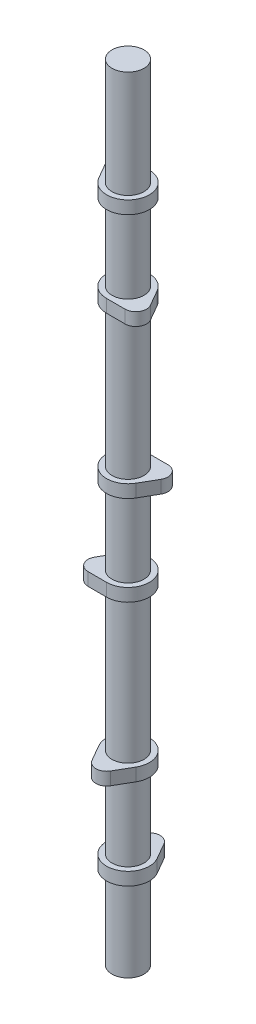
ISO-10303-21;
HEADER;
FILE_DESCRIPTION(('STEP AP214'),'2;1');
FILE_NAME('part.step','',(''),(''),'','','');
FILE_SCHEMA(('AUTOMOTIVE_DESIGN { 1 0 10303 214 1 1 1 1 }'));
ENDSEC;
DATA;
#1=APPLICATION_CONTEXT('core data for automotive mechanical design processes');
#2=APPLICATION_PROTOCOL_DEFINITION('international standard','automotive_design',2000,#1);
#3=PRODUCT_CONTEXT('',#1,'mechanical');
#4=PRODUCT('Part','Part','',(#3));
#5=PRODUCT_RELATED_PRODUCT_CATEGORY('part','',(#4));
#6=PRODUCT_DEFINITION_FORMATION('','',#4);
#7=PRODUCT_DEFINITION_CONTEXT('part definition',#1,'design');
#8=PRODUCT_DEFINITION('design','',#6,#7);
#9=PRODUCT_DEFINITION_SHAPE('','',#8);
#10=(LENGTH_UNIT() NAMED_UNIT(*) SI_UNIT(.MILLI.,.METRE.));
#11=(NAMED_UNIT(*) PLANE_ANGLE_UNIT() SI_UNIT($,.RADIAN.));
#12=(NAMED_UNIT(*) SI_UNIT($,.STERADIAN.) SOLID_ANGLE_UNIT());
#13=UNCERTAINTY_MEASURE_WITH_UNIT(LENGTH_MEASURE(1.E-05),#10,'distance_accuracy_value','');
#14=(GEOMETRIC_REPRESENTATION_CONTEXT(3) GLOBAL_UNCERTAINTY_ASSIGNED_CONTEXT((#13)) GLOBAL_UNIT_ASSIGNED_CONTEXT((#10,
#11,#12)) REPRESENTATION_CONTEXT('',''));
#15=CARTESIAN_POINT('',(0.,0.,0.));
#16=DIRECTION('',(0.,0.,1.));
#17=DIRECTION('',(1.,0.,0.));
#18=AXIS2_PLACEMENT_3D('',#15,#16,#17);
#19=CARTESIAN_POINT('',(0.,416.56,0.));
#20=DIRECTION('',(0.,-1.,0.));
#21=DIRECTION('',(0.,0.,-1.));
#22=AXIS2_PLACEMENT_3D('',#19,#20,#21);
#23=CYLINDRICAL_SURFACE('',#22,9.5);
#24=CARTESIAN_POINT('',(0.,299.73,0.));
#25=DIRECTION('',(0.,1.,0.));
#26=DIRECTION('',(0.,0.,1.));
#27=AXIS2_PLACEMENT_3D('',#24,#25,#26);
#28=CIRCLE('',#27,9.5);
#29=CARTESIAN_POINT('',(0.,299.73,9.5));
#30=VERTEX_POINT('',#29);
#31=EDGE_CURVE('E291',#30,#30,#28,.T.);
#32=ORIENTED_EDGE('',*,*,#31,.T.);
#33=EDGE_LOOP('',(#32));
#34=FACE_BOUND('',#33,.T.);
#35=CARTESIAN_POINT('',(0.,345.44,0.));
#36=DIRECTION('',(0.,1.,0.));
#37=DIRECTION('',(0.,0.,1.));
#38=AXIS2_PLACEMENT_3D('',#35,#36,#37);
#39=CIRCLE('',#38,9.5);
#40=CARTESIAN_POINT('',(0.,345.44,9.5));
#41=VERTEX_POINT('',#40);
#42=EDGE_CURVE('E11',#41,#41,#39,.T.);
#43=ORIENTED_EDGE('',*,*,#42,.F.);
#44=EDGE_LOOP('',(#43));
#45=FACE_BOUND('',#44,.T.);
#46=ADVANCED_FACE('F39',(#34,#45),#23,.T.);
#47=CARTESIAN_POINT('',(0.,207.02,0.));
#48=DIRECTION('',(0.,1.,0.));
#49=DIRECTION('',(0.,0.,1.));
#50=AXIS2_PLACEMENT_3D('',#47,#48,#49);
#51=CIRCLE('',#50,9.5);
#52=CARTESIAN_POINT('',(0.,207.02,9.5));
#53=VERTEX_POINT('',#52);
#54=EDGE_CURVE('E334',#53,#53,#51,.T.);
#55=ORIENTED_EDGE('',*,*,#54,.T.);
#56=EDGE_LOOP('',(#55));
#57=FACE_BOUND('',#56,.T.);
#58=CARTESIAN_POINT('',(0.,292.1,0.));
#59=DIRECTION('',(0.,1.,0.));
#60=DIRECTION('',(0.,0.,1.));
#61=AXIS2_PLACEMENT_3D('',#58,#59,#60);
#62=CIRCLE('',#61,9.5);
#63=CARTESIAN_POINT('',(0.,292.1,9.5));
#64=VERTEX_POINT('',#63);
#65=EDGE_CURVE('E50',#64,#64,#62,.T.);
#66=ORIENTED_EDGE('',*,*,#65,.F.);
#67=EDGE_LOOP('',(#66));
#68=FACE_BOUND('',#67,.T.);
#69=ADVANCED_FACE('F533',(#57,#68),#23,.T.);
#70=CARTESIAN_POINT('',(0.,153.68,0.));
#71=DIRECTION('',(0.,1.,0.));
#72=DIRECTION('',(0.,0.,1.));
#73=AXIS2_PLACEMENT_3D('',#70,#71,#72);
#74=CIRCLE('',#73,9.5);
#75=CARTESIAN_POINT('',(0.,153.68,9.5));
#76=VERTEX_POINT('',#75);
#77=EDGE_CURVE('E377',#76,#76,#74,.T.);
#78=ORIENTED_EDGE('',*,*,#77,.T.);
#79=EDGE_LOOP('',(#78));
#80=FACE_BOUND('',#79,.T.);
#81=CARTESIAN_POINT('',(0.,199.39,0.));
#82=DIRECTION('',(0.,1.,0.));
#83=DIRECTION('',(0.,0.,1.));
#84=AXIS2_PLACEMENT_3D('',#81,#82,#83);
#85=CIRCLE('',#84,9.5);
#86=CARTESIAN_POINT('',(0.,199.39,9.5));
#87=VERTEX_POINT('',#86);
#88=EDGE_CURVE('E481',#87,#87,#85,.T.);
#89=ORIENTED_EDGE('',*,*,#88,.F.);
#90=EDGE_LOOP('',(#89));
#91=FACE_BOUND('',#90,.T.);
#92=ADVANCED_FACE('F539',(#80,#91),#23,.T.);
#93=CARTESIAN_POINT('',(0.,60.97,0.));
#94=DIRECTION('',(0.,1.,0.));
#95=DIRECTION('',(0.,0.,1.));
#96=AXIS2_PLACEMENT_3D('',#93,#94,#95);
#97=CIRCLE('',#96,9.5);
#98=CARTESIAN_POINT('',(0.,60.97,9.5));
#99=VERTEX_POINT('',#98);
#100=EDGE_CURVE('E420',#99,#99,#97,.T.);
#101=ORIENTED_EDGE('',*,*,#100,.T.);
#102=EDGE_LOOP('',(#101));
#103=FACE_BOUND('',#102,.T.);
#104=CARTESIAN_POINT('',(0.,146.05,0.));
#105=DIRECTION('',(0.,1.,0.));
#106=DIRECTION('',(0.,0.,1.));
#107=AXIS2_PLACEMENT_3D('',#104,#105,#106);
#108=CIRCLE('',#107,9.5);
#109=CARTESIAN_POINT('',(0.,146.05,9.5));
#110=VERTEX_POINT('',#109);
#111=EDGE_CURVE('E474',#110,#110,#108,.T.);
#112=ORIENTED_EDGE('',*,*,#111,.F.);
#113=EDGE_LOOP('',(#112));
#114=FACE_BOUND('',#113,.T.);
#115=ADVANCED_FACE('F570',(#103,#114),#23,.T.);
#116=CARTESIAN_POINT('',(0.,7.63000000000003,0.));
#117=DIRECTION('',(0.,1.,0.));
#118=DIRECTION('',(0.,0.,1.));
#119=AXIS2_PLACEMENT_3D('',#116,#117,#118);
#120=CIRCLE('',#119,9.5);
#121=CARTESIAN_POINT('',(0.,7.63000000000003,9.5));
#122=VERTEX_POINT('',#121);
#123=EDGE_CURVE('E425',#122,#122,#120,.F.);
#124=ORIENTED_EDGE('',*,*,#123,.F.);
#125=EDGE_LOOP('',(#124));
#126=FACE_BOUND('',#125,.T.);
#127=CARTESIAN_POINT('',(0.,53.34,0.));
#128=DIRECTION('',(0.,1.,0.));
#129=DIRECTION('',(0.,0.,1.));
#130=AXIS2_PLACEMENT_3D('',#127,#128,#129);
#131=CIRCLE('',#130,9.5);
#132=CARTESIAN_POINT('',(0.,53.34,9.5));
#133=VERTEX_POINT('',#132);
#134=EDGE_CURVE('E470',#133,#133,#131,.T.);
#135=ORIENTED_EDGE('',*,*,#134,.F.);
#136=EDGE_LOOP('',(#135));
#137=FACE_BOUND('',#136,.T.);
#138=ADVANCED_FACE('F558',(#126,#137),#23,.T.);
#139=CARTESIAN_POINT('',(0.,7.63,-12.7));
#140=DIRECTION('',(0.,-1.,0.));
#141=DIRECTION('',(0.,0.,-1.));
#142=AXIS2_PLACEMENT_3D('',#139,#140,#141);
#143=CYLINDRICAL_SURFACE('',#142,6.35);
#144=CARTESIAN_POINT('',(0.,0.,-12.7));
#145=DIRECTION('',(0.,1.,0.));
#146=DIRECTION('',(0.,0.,1.));
#147=AXIS2_PLACEMENT_3D('',#144,#145,#146);
#148=CIRCLE('',#147,6.35);
#149=CARTESIAN_POINT('',(5.49926131403119,0.,-15.875));
#150=VERTEX_POINT('',#149);
#151=CARTESIAN_POINT('',(-5.49926131403118,0.,-15.875));
#152=VERTEX_POINT('',#151);
#153=EDGE_CURVE('E433',#150,#152,#148,.T.);
#154=ORIENTED_EDGE('',*,*,#153,.T.);
#155=DIRECTION('',(0.,-1.,0.));
#156=VECTOR('',#155,1.);
#157=CARTESIAN_POINT('',(-5.49926131403118,7.63,-15.875));
#158=LINE('',#157,#156);
#159=CARTESIAN_POINT('',(-5.49926131403118,7.63,-15.875));
#160=VERTEX_POINT('',#159);
#161=EDGE_CURVE('E463',#160,#152,#158,.T.);
#162=ORIENTED_EDGE('',*,*,#161,.F.);
#163=CARTESIAN_POINT('',(0.,7.63,-12.7));
#164=DIRECTION('',(0.,1.,0.));
#165=DIRECTION('',(0.,0.,1.));
#166=AXIS2_PLACEMENT_3D('',#163,#164,#165);
#167=CIRCLE('',#166,6.35);
#168=CARTESIAN_POINT('',(5.49926131403119,7.63,-15.875));
#169=VERTEX_POINT('',#168);
#170=EDGE_CURVE('E434',#169,#160,#167,.T.);
#171=ORIENTED_EDGE('',*,*,#170,.F.);
#172=DIRECTION('',(0.,-1.,0.));
#173=VECTOR('',#172,1.);
#174=CARTESIAN_POINT('',(5.49926131403119,7.63,-15.875));
#175=LINE('',#174,#173);
#176=EDGE_CURVE('E444',#169,#150,#175,.T.);
#177=ORIENTED_EDGE('',*,*,#176,.T.);
#178=EDGE_LOOP('',(#154,#162,#171,#177));
#179=FACE_BOUND('',#178,.T.);
#180=ADVANCED_FACE('F41',(#179),#143,.T.);
#181=CARTESIAN_POINT('',(-5.49926131403118,7.63,-15.875));
#182=DIRECTION('',(0.866025403784439,0.,0.5));
#183=DIRECTION('',(0.5,0.,-0.866025403784439));
#184=AXIS2_PLACEMENT_3D('',#181,#182,#183);
#185=PLANE('',#184);
#186=DIRECTION('',(-0.5,0.,0.866025403784439));
#187=VECTOR('',#186,1.);
#188=CARTESIAN_POINT('',(-5.49926131403118,0.,-15.875));
#189=LINE('',#188,#187);
#190=CARTESIAN_POINT('',(-10.9985226280624,0.,-6.35000000000001));
#191=VERTEX_POINT('',#190);
#192=EDGE_CURVE('E448',#152,#191,#189,.T.);
#193=ORIENTED_EDGE('',*,*,#192,.T.);
#194=DIRECTION('',(0.,-1.,0.));
#195=VECTOR('',#194,1.);
#196=CARTESIAN_POINT('',(-10.9985226280624,7.63,-6.35000000000001));
#197=LINE('',#196,#195);
#198=CARTESIAN_POINT('',(-10.9985226280624,7.63,-6.35000000000001));
#199=VERTEX_POINT('',#198);
#200=EDGE_CURVE('E460',#199,#191,#197,.T.);
#201=ORIENTED_EDGE('',*,*,#200,.F.);
#202=DIRECTION('',(-0.5,0.,0.866025403784439));
#203=VECTOR('',#202,1.);
#204=CARTESIAN_POINT('',(-5.49926131403118,7.63,-15.875));
#205=LINE('',#204,#203);
#206=EDGE_CURVE('E90',#160,#199,#205,.T.);
#207=ORIENTED_EDGE('',*,*,#206,.F.);
#208=ORIENTED_EDGE('',*,*,#161,.T.);
#209=EDGE_LOOP('',(#193,#201,#207,#208));
#210=FACE_BOUND('',#209,.T.);
#211=ADVANCED_FACE('F576',(#210),#185,.F.);
#212=CARTESIAN_POINT('',(0.,7.63,0.));
#213=DIRECTION('',(0.,-1.,0.));
#214=DIRECTION('',(0.,0.,-1.));
#215=AXIS2_PLACEMENT_3D('',#212,#213,#214);
#216=CYLINDRICAL_SURFACE('',#215,12.7);
#217=CARTESIAN_POINT('',(0.,0.,0.));
#218=DIRECTION('',(0.,1.,0.));
#219=DIRECTION('',(0.,0.,1.));
#220=AXIS2_PLACEMENT_3D('',#217,#218,#219);
#221=CIRCLE('',#220,12.7);
#222=CARTESIAN_POINT('',(10.9985226280624,0.,-6.35));
#223=VERTEX_POINT('',#222);
#224=EDGE_CURVE('E76',#191,#223,#221,.T.);
#225=ORIENTED_EDGE('',*,*,#224,.T.);
#226=DIRECTION('',(0.,-1.,0.));
#227=VECTOR('',#226,1.);
#228=CARTESIAN_POINT('',(10.9985226280624,7.63,-6.35));
#229=LINE('',#228,#227);
#230=CARTESIAN_POINT('',(10.9985226280624,7.63,-6.35));
#231=VERTEX_POINT('',#230);
#232=EDGE_CURVE('E457',#231,#223,#229,.T.);
#233=ORIENTED_EDGE('',*,*,#232,.F.);
#234=CARTESIAN_POINT('',(0.,7.63,0.));
#235=DIRECTION('',(0.,1.,0.));
#236=DIRECTION('',(0.,0.,1.));
#237=AXIS2_PLACEMENT_3D('',#234,#235,#236);
#238=CIRCLE('',#237,12.7);
#239=EDGE_CURVE('E439',#199,#231,#238,.T.);
#240=ORIENTED_EDGE('',*,*,#239,.F.);
#241=ORIENTED_EDGE('',*,*,#200,.T.);
#242=EDGE_LOOP('',(#225,#233,#240,#241));
#243=FACE_BOUND('',#242,.T.);
#244=ADVANCED_FACE('F908',(#243),#216,.T.);
#245=CARTESIAN_POINT('',(5.49926131403119,7.63,-15.875));
#246=DIRECTION('',(-0.866025403784439,0.,0.5));
#247=DIRECTION('',(0.5,0.,0.866025403784439));
#248=AXIS2_PLACEMENT_3D('',#245,#246,#247);
#249=PLANE('',#248);
#250=DIRECTION('',(-0.5,0.,-0.866025403784439));
#251=VECTOR('',#250,1.);
#252=CARTESIAN_POINT('',(5.49926131403119,0.,-15.875));
#253=LINE('',#252,#251);
#254=EDGE_CURVE('E82',#223,#150,#253,.T.);
#255=ORIENTED_EDGE('',*,*,#254,.T.);
#256=ORIENTED_EDGE('',*,*,#176,.F.);
#257=DIRECTION('',(-0.5,0.,-0.866025403784439));
#258=VECTOR('',#257,1.);
#259=CARTESIAN_POINT('',(5.49926131403119,7.63,-15.875));
#260=LINE('',#259,#258);
#261=EDGE_CURVE('E58',#231,#169,#260,.T.);
#262=ORIENTED_EDGE('',*,*,#261,.F.);
#263=ORIENTED_EDGE('',*,*,#232,.T.);
#264=EDGE_LOOP('',(#255,#256,#262,#263));
#265=FACE_BOUND('',#264,.T.);
#266=ADVANCED_FACE('F902',(#265),#249,.F.);
#267=CARTESIAN_POINT('',(0.,7.63,-12.7));
#268=DIRECTION('',(0.,1.,0.));
#269=DIRECTION('',(0.,0.,1.));
#270=AXIS2_PLACEMENT_3D('',#267,#268,#269);
#271=PLANE('',#270);
#272=ORIENTED_EDGE('',*,*,#123,.T.);
#273=EDGE_LOOP('',(#272));
#274=FACE_BOUND('',#273,.T.);
#275=ORIENTED_EDGE('',*,*,#170,.T.);
#276=ORIENTED_EDGE('',*,*,#206,.T.);
#277=ORIENTED_EDGE('',*,*,#239,.T.);
#278=ORIENTED_EDGE('',*,*,#261,.T.);
#279=EDGE_LOOP('',(#275,#276,#277,#278));
#280=FACE_BOUND('',#279,.T.);
#281=ADVANCED_FACE('F907',(#274,#280),#271,.T.);
#282=CARTESIAN_POINT('',(0.,0.,-12.7));
#283=DIRECTION('',(0.,1.,0.));
#284=DIRECTION('',(0.,0.,1.));
#285=AXIS2_PLACEMENT_3D('',#282,#283,#284);
#286=PLANE('',#285);
#287=CARTESIAN_POINT('',(0.,0.,0.));
#288=DIRECTION('',(0.,1.,0.));
#289=DIRECTION('',(0.,0.,1.));
#290=AXIS2_PLACEMENT_3D('',#287,#288,#289);
#291=CIRCLE('',#290,9.5);
#292=CARTESIAN_POINT('',(0.,0.,9.5));
#293=VERTEX_POINT('',#292);
#294=EDGE_CURVE('E466',#293,#293,#291,.F.);
#295=ORIENTED_EDGE('',*,*,#294,.F.);
#296=EDGE_LOOP('',(#295));
#297=FACE_BOUND('',#296,.T.);
#298=ORIENTED_EDGE('',*,*,#153,.F.);
#299=ORIENTED_EDGE('',*,*,#254,.F.);
#300=ORIENTED_EDGE('',*,*,#224,.F.);
#301=ORIENTED_EDGE('',*,*,#192,.F.);
#302=EDGE_LOOP('',(#298,#299,#300,#301));
#303=FACE_BOUND('',#302,.T.);
#304=ADVANCED_FACE('F566',(#297,#303),#286,.F.);
#305=CARTESIAN_POINT('',(0.,-49.53,0.));
#306=DIRECTION('',(0.,1.,0.));
#307=DIRECTION('',(0.,0.,1.));
#308=AXIS2_PLACEMENT_3D('',#305,#306,#307);
#309=PLANE('',#308);
#310=CARTESIAN_POINT('',(0.,-49.53,0.));
#311=DIRECTION('',(0.,1.,0.));
#312=DIRECTION('',(0.,0.,1.));
#313=AXIS2_PLACEMENT_3D('',#310,#311,#312);
#314=CIRCLE('',#313,9.5);
#315=CARTESIAN_POINT('',(0.,-49.53,9.5));
#316=VERTEX_POINT('',#315);
#317=EDGE_CURVE('E426',#316,#316,#314,.T.);
#318=ORIENTED_EDGE('',*,*,#317,.F.);
#319=EDGE_LOOP('',(#318));
#320=FACE_BOUND('',#319,.T.);
#321=ADVANCED_FACE('F556',(#320),#309,.F.);
#322=ORIENTED_EDGE('',*,*,#317,.T.);
#323=EDGE_LOOP('',(#322));
#324=FACE_BOUND('',#323,.T.);
#325=ORIENTED_EDGE('',*,*,#294,.T.);
#326=EDGE_LOOP('',(#325));
#327=FACE_BOUND('',#326,.T.);
#328=ADVANCED_FACE('F546',(#324,#327),#23,.T.);
#329=CARTESIAN_POINT('',(0.,60.97,12.7));
#330=DIRECTION('',(0.,-1.,0.));
#331=DIRECTION('',(0.,0.,1.));
#332=AXIS2_PLACEMENT_3D('',#329,#330,#331);
#333=CYLINDRICAL_SURFACE('',#332,6.35);
#334=CARTESIAN_POINT('',(0.,53.34,12.7));
#335=DIRECTION('',(0.,1.,0.));
#336=DIRECTION('',(0.,0.,-1.));
#337=AXIS2_PLACEMENT_3D('',#334,#335,#336);
#338=CIRCLE('',#337,6.35);
#339=CARTESIAN_POINT('',(-5.4992613140313,53.34,15.875));
#340=VERTEX_POINT('',#339);
#341=CARTESIAN_POINT('',(5.49926131403107,53.34,15.875));
#342=VERTEX_POINT('',#341);
#343=EDGE_CURVE('E393',#340,#342,#338,.T.);
#344=ORIENTED_EDGE('',*,*,#343,.T.);
#345=DIRECTION('',(0.,-1.,0.));
#346=VECTOR('',#345,1.);
#347=CARTESIAN_POINT('',(5.49926131403107,60.97,15.875));
#348=LINE('',#347,#346);
#349=CARTESIAN_POINT('',(5.49926131403107,60.97,15.875));
#350=VERTEX_POINT('',#349);
#351=EDGE_CURVE('E416',#350,#342,#348,.T.);
#352=ORIENTED_EDGE('',*,*,#351,.F.);
#353=CARTESIAN_POINT('',(0.,60.97,12.7));
#354=DIRECTION('',(0.,1.,0.));
#355=DIRECTION('',(0.,0.,-1.));
#356=AXIS2_PLACEMENT_3D('',#353,#354,#355);
#357=CIRCLE('',#356,6.35);
#358=CARTESIAN_POINT('',(-5.4992613140313,60.97,15.875));
#359=VERTEX_POINT('',#358);
#360=EDGE_CURVE('E378',#359,#350,#357,.T.);
#361=ORIENTED_EDGE('',*,*,#360,.F.);
#362=DIRECTION('',(0.,-1.,0.));
#363=VECTOR('',#362,1.);
#364=CARTESIAN_POINT('',(-5.4992613140313,60.97,15.875));
#365=LINE('',#364,#363);
#366=EDGE_CURVE('E392',#359,#340,#365,.T.);
#367=ORIENTED_EDGE('',*,*,#366,.T.);
#368=EDGE_LOOP('',(#344,#352,#361,#367));
#369=FACE_BOUND('',#368,.T.);
#370=ADVANCED_FACE('F555',(#369),#333,.T.);
#371=CARTESIAN_POINT('',(5.49926131403107,60.97,15.875));
#372=DIRECTION('',(-0.866025403784435,0.,-0.500000000000006));
#373=DIRECTION('',(-0.500000000000006,0.,0.866025403784435));
#374=AXIS2_PLACEMENT_3D('',#371,#372,#373);
#375=PLANE('',#374);
#376=DIRECTION('',(0.500000000000006,0.,-0.866025403784435));
#377=VECTOR('',#376,1.);
#378=CARTESIAN_POINT('',(5.49926131403107,53.34,15.875));
#379=LINE('',#378,#377);
#380=CARTESIAN_POINT('',(10.9985226280623,53.34,6.35000000000008));
#381=VERTEX_POINT('',#380);
#382=EDGE_CURVE('E397',#342,#381,#379,.T.);
#383=ORIENTED_EDGE('',*,*,#382,.T.);
#384=DIRECTION('',(0.,-1.,0.));
#385=VECTOR('',#384,1.);
#386=CARTESIAN_POINT('',(10.9985226280623,60.97,6.35000000000008));
#387=LINE('',#386,#385);
#388=CARTESIAN_POINT('',(10.9985226280623,60.97,6.35000000000008));
#389=VERTEX_POINT('',#388);
#390=EDGE_CURVE('E412',#389,#381,#387,.T.);
#391=ORIENTED_EDGE('',*,*,#390,.F.);
#392=DIRECTION('',(0.500000000000006,0.,-0.866025403784435));
#393=VECTOR('',#392,1.);
#394=CARTESIAN_POINT('',(5.49926131403107,60.97,15.875));
#395=LINE('',#394,#393);
#396=EDGE_CURVE('E382',#350,#389,#395,.T.);
#397=ORIENTED_EDGE('',*,*,#396,.F.);
#398=ORIENTED_EDGE('',*,*,#351,.T.);
#399=EDGE_LOOP('',(#383,#391,#397,#398));
#400=FACE_BOUND('',#399,.T.);
#401=ADVANCED_FACE('F563',(#400),#375,.F.);
#402=CARTESIAN_POINT('',(0.,60.97,0.));
#403=DIRECTION('',(0.,-1.,0.));
#404=DIRECTION('',(0.,0.,1.));
#405=AXIS2_PLACEMENT_3D('',#402,#403,#404);
#406=CYLINDRICAL_SURFACE('',#405,12.7);
#407=CARTESIAN_POINT('',(0.,53.34,0.));
#408=DIRECTION('',(0.,1.,0.));
#409=DIRECTION('',(0.,0.,-1.));
#410=AXIS2_PLACEMENT_3D('',#407,#408,#409);
#411=CIRCLE('',#410,12.7);
#412=CARTESIAN_POINT('',(-10.9985226280624,53.34,6.34999999999992));
#413=VERTEX_POINT('',#412);
#414=EDGE_CURVE('E400',#381,#413,#411,.T.);
#415=ORIENTED_EDGE('',*,*,#414,.T.);
#416=DIRECTION('',(0.,-1.,0.));
#417=VECTOR('',#416,1.);
#418=CARTESIAN_POINT('',(-10.9985226280624,60.97,6.34999999999992));
#419=LINE('',#418,#417);
#420=CARTESIAN_POINT('',(-10.9985226280624,60.97,6.34999999999992));
#421=VERTEX_POINT('',#420);
#422=EDGE_CURVE('E408',#421,#413,#419,.T.);
#423=ORIENTED_EDGE('',*,*,#422,.F.);
#424=CARTESIAN_POINT('',(0.,60.97,0.));
#425=DIRECTION('',(0.,1.,0.));
#426=DIRECTION('',(0.,0.,-1.));
#427=AXIS2_PLACEMENT_3D('',#424,#425,#426);
#428=CIRCLE('',#427,12.7);
#429=EDGE_CURVE('E386',#389,#421,#428,.T.);
#430=ORIENTED_EDGE('',*,*,#429,.F.);
#431=ORIENTED_EDGE('',*,*,#390,.T.);
#432=EDGE_LOOP('',(#415,#423,#430,#431));
#433=FACE_BOUND('',#432,.T.);
#434=ADVANCED_FACE('F601',(#433),#406,.T.);
#435=CARTESIAN_POINT('',(-5.4992613140313,60.97,15.875));
#436=DIRECTION('',(0.866025403784442,0.,-0.499999999999994));
#437=DIRECTION('',(-0.499999999999994,0.,-0.866025403784442));
#438=AXIS2_PLACEMENT_3D('',#435,#436,#437);
#439=PLANE('',#438);
#440=DIRECTION('',(0.499999999999994,0.,0.866025403784442));
#441=VECTOR('',#440,1.);
#442=CARTESIAN_POINT('',(-5.4992613140313,53.34,15.875));
#443=LINE('',#442,#441);
#444=EDGE_CURVE('E383',#413,#340,#443,.T.);
#445=ORIENTED_EDGE('',*,*,#444,.T.);
#446=ORIENTED_EDGE('',*,*,#366,.F.);
#447=DIRECTION('',(0.499999999999994,0.,0.866025403784442));
#448=VECTOR('',#447,1.);
#449=CARTESIAN_POINT('',(-5.4992613140313,60.97,15.875));
#450=LINE('',#449,#448);
#451=EDGE_CURVE('E389',#421,#359,#450,.T.);
#452=ORIENTED_EDGE('',*,*,#451,.F.);
#453=ORIENTED_EDGE('',*,*,#422,.T.);
#454=EDGE_LOOP('',(#445,#446,#452,#453));
#455=FACE_BOUND('',#454,.T.);
#456=ADVANCED_FACE('F597',(#455),#439,.F.);
#457=CARTESIAN_POINT('',(0.,60.97,12.7));
#458=DIRECTION('',(0.,1.,0.));
#459=DIRECTION('',(0.,0.,-1.));
#460=AXIS2_PLACEMENT_3D('',#457,#458,#459);
#461=PLANE('',#460);
#462=ORIENTED_EDGE('',*,*,#100,.F.);
#463=EDGE_LOOP('',(#462));
#464=FACE_BOUND('',#463,.T.);
#465=ORIENTED_EDGE('',*,*,#360,.T.);
#466=ORIENTED_EDGE('',*,*,#396,.T.);
#467=ORIENTED_EDGE('',*,*,#429,.T.);
#468=ORIENTED_EDGE('',*,*,#451,.T.);
#469=EDGE_LOOP('',(#465,#466,#467,#468));
#470=FACE_BOUND('',#469,.T.);
#471=ADVANCED_FACE('F587',(#464,#470),#461,.T.);
#472=CARTESIAN_POINT('',(0.,53.34,12.7));
#473=DIRECTION('',(0.,1.,0.));
#474=DIRECTION('',(0.,0.,-1.));
#475=AXIS2_PLACEMENT_3D('',#472,#473,#474);
#476=PLANE('',#475);
#477=ORIENTED_EDGE('',*,*,#134,.T.);
#478=EDGE_LOOP('',(#477));
#479=FACE_BOUND('',#478,.T.);
#480=ORIENTED_EDGE('',*,*,#343,.F.);
#481=ORIENTED_EDGE('',*,*,#444,.F.);
#482=ORIENTED_EDGE('',*,*,#414,.F.);
#483=ORIENTED_EDGE('',*,*,#382,.F.);
#484=EDGE_LOOP('',(#480,#481,#482,#483));
#485=FACE_BOUND('',#484,.T.);
#486=ADVANCED_FACE('F583',(#479,#485),#476,.F.);
#487=CARTESIAN_POINT('',(-10.9985226280623,153.68,6.35000000000005));
#488=DIRECTION('',(0.,-1.,0.));
#489=DIRECTION('',(-0.866025403784436,0.,0.500000000000004));
#490=AXIS2_PLACEMENT_3D('',#487,#488,#489);
#491=CYLINDRICAL_SURFACE('',#490,6.35);
#492=CARTESIAN_POINT('',(-10.9985226280623,146.05,6.35000000000005));
#493=DIRECTION('',(0.,1.,0.));
#494=DIRECTION('',(0.866025403784436,0.,-0.500000000000004));
#495=AXIS2_PLACEMENT_3D('',#492,#493,#494);
#496=CIRCLE('',#495,6.35);
#497=CARTESIAN_POINT('',(-16.4977839420935,146.05,3.17500000000008));
#498=VERTEX_POINT('',#497);
#499=CARTESIAN_POINT('',(-10.9985226280623,146.05,12.7000000000001));
#500=VERTEX_POINT('',#499);
#501=EDGE_CURVE('E350',#498,#500,#496,.T.);
#502=ORIENTED_EDGE('',*,*,#501,.T.);
#503=DIRECTION('',(0.,-1.,0.));
#504=VECTOR('',#503,1.);
#505=CARTESIAN_POINT('',(-10.9985226280623,153.68,12.7000000000001));
#506=LINE('',#505,#504);
#507=CARTESIAN_POINT('',(-10.9985226280623,153.68,12.7000000000001));
#508=VERTEX_POINT('',#507);
#509=EDGE_CURVE('E373',#508,#500,#506,.T.);
#510=ORIENTED_EDGE('',*,*,#509,.F.);
#511=CARTESIAN_POINT('',(-10.9985226280623,153.68,6.35000000000005));
#512=DIRECTION('',(0.,1.,0.));
#513=DIRECTION('',(0.866025403784436,0.,-0.500000000000004));
#514=AXIS2_PLACEMENT_3D('',#511,#512,#513);
#515=CIRCLE('',#514,6.35);
#516=CARTESIAN_POINT('',(-16.4977839420935,153.68,3.17500000000008));
#517=VERTEX_POINT('',#516);
#518=EDGE_CURVE('E335',#517,#508,#515,.T.);
#519=ORIENTED_EDGE('',*,*,#518,.F.);
#520=DIRECTION('',(0.,-1.,0.));
#521=VECTOR('',#520,1.);
#522=CARTESIAN_POINT('',(-16.4977839420935,153.68,3.17500000000008));
#523=LINE('',#522,#521);
#524=EDGE_CURVE('E349',#517,#498,#523,.T.);
#525=ORIENTED_EDGE('',*,*,#524,.T.);
#526=EDGE_LOOP('',(#502,#510,#519,#525));
#527=FACE_BOUND('',#526,.T.);
#528=ADVANCED_FACE('F586',(#527),#491,.T.);
#529=CARTESIAN_POINT('',(-10.9985226280623,153.68,12.7000000000001));
#530=DIRECTION('',(0.,0.,-1.));
#531=DIRECTION('',(-1.,0.,0.));
#532=AXIS2_PLACEMENT_3D('',#529,#530,#531);
#533=PLANE('',#532);
#534=DIRECTION('',(1.,0.,0.));
#535=VECTOR('',#534,1.);
#536=CARTESIAN_POINT('',(-10.9985226280623,146.05,12.7000000000001));
#537=LINE('',#536,#535);
#538=CARTESIAN_POINT('',(0.,146.05,12.7));
#539=VERTEX_POINT('',#538);
#540=EDGE_CURVE('E354',#500,#539,#537,.T.);
#541=ORIENTED_EDGE('',*,*,#540,.T.);
#542=DIRECTION('',(0.,-1.,0.));
#543=VECTOR('',#542,1.);
#544=CARTESIAN_POINT('',(0.,153.68,12.7));
#545=LINE('',#544,#543);
#546=CARTESIAN_POINT('',(0.,153.68,12.7));
#547=VERTEX_POINT('',#546);
#548=EDGE_CURVE('E369',#547,#539,#545,.T.);
#549=ORIENTED_EDGE('',*,*,#548,.F.);
#550=DIRECTION('',(1.,0.,0.));
#551=VECTOR('',#550,1.);
#552=CARTESIAN_POINT('',(-10.9985226280623,153.68,12.7000000000001));
#553=LINE('',#552,#551);
#554=EDGE_CURVE('E339',#508,#547,#553,.T.);
#555=ORIENTED_EDGE('',*,*,#554,.F.);
#556=ORIENTED_EDGE('',*,*,#509,.T.);
#557=EDGE_LOOP('',(#541,#549,#555,#556));
#558=FACE_BOUND('',#557,.T.);
#559=ADVANCED_FACE('F650',(#558),#533,.F.);
#560=CARTESIAN_POINT('',(0.,153.68,0.));
#561=DIRECTION('',(0.,-1.,0.));
#562=DIRECTION('',(-0.866025403784436,0.,0.500000000000004));
#563=AXIS2_PLACEMENT_3D('',#560,#561,#562);
#564=CYLINDRICAL_SURFACE('',#563,12.7);
#565=CARTESIAN_POINT('',(0.,146.05,0.));
#566=DIRECTION('',(0.,1.,0.));
#567=DIRECTION('',(0.866025403784436,0.,-0.500000000000004));
#568=AXIS2_PLACEMENT_3D('',#565,#566,#567);
#569=CIRCLE('',#568,12.7);
#570=CARTESIAN_POINT('',(-10.9985226280624,146.05,-6.34999999999995));
#571=VERTEX_POINT('',#570);
#572=EDGE_CURVE('E357',#539,#571,#569,.T.);
#573=ORIENTED_EDGE('',*,*,#572,.T.);
#574=DIRECTION('',(0.,-1.,0.));
#575=VECTOR('',#574,1.);
#576=CARTESIAN_POINT('',(-10.9985226280624,153.68,-6.34999999999995));
#577=LINE('',#576,#575);
#578=CARTESIAN_POINT('',(-10.9985226280624,153.68,-6.34999999999995));
#579=VERTEX_POINT('',#578);
#580=EDGE_CURVE('E365',#579,#571,#577,.T.);
#581=ORIENTED_EDGE('',*,*,#580,.F.);
#582=CARTESIAN_POINT('',(0.,153.68,0.));
#583=DIRECTION('',(0.,1.,0.));
#584=DIRECTION('',(0.866025403784436,0.,-0.500000000000004));
#585=AXIS2_PLACEMENT_3D('',#582,#583,#584);
#586=CIRCLE('',#585,12.7);
#587=EDGE_CURVE('E343',#547,#579,#586,.T.);
#588=ORIENTED_EDGE('',*,*,#587,.F.);
#589=ORIENTED_EDGE('',*,*,#548,.T.);
#590=EDGE_LOOP('',(#573,#581,#588,#589));
#591=FACE_BOUND('',#590,.T.);
#592=ADVANCED_FACE('F659',(#591),#564,.T.);
#593=CARTESIAN_POINT('',(-16.4977839420935,153.68,3.17500000000008));
#594=DIRECTION('',(0.866025403784441,0.,0.499999999999996));
#595=DIRECTION('',(0.499999999999996,0.,-0.866025403784441));
#596=AXIS2_PLACEMENT_3D('',#593,#594,#595);
#597=PLANE('',#596);
#598=DIRECTION('',(-0.499999999999996,0.,0.866025403784441));
#599=VECTOR('',#598,1.);
#600=CARTESIAN_POINT('',(-16.4977839420935,146.05,3.17500000000008));
#601=LINE('',#600,#599);
#602=EDGE_CURVE('E340',#571,#498,#601,.T.);
#603=ORIENTED_EDGE('',*,*,#602,.T.);
#604=ORIENTED_EDGE('',*,*,#524,.F.);
#605=DIRECTION('',(-0.499999999999996,0.,0.866025403784441));
#606=VECTOR('',#605,1.);
#607=CARTESIAN_POINT('',(-16.4977839420935,153.68,3.17500000000008));
#608=LINE('',#607,#606);
#609=EDGE_CURVE('E346',#579,#517,#608,.T.);
#610=ORIENTED_EDGE('',*,*,#609,.F.);
#611=ORIENTED_EDGE('',*,*,#580,.T.);
#612=EDGE_LOOP('',(#603,#604,#610,#611));
#613=FACE_BOUND('',#612,.T.);
#614=ADVANCED_FACE('F668',(#613),#597,.F.);
#615=CARTESIAN_POINT('',(-10.9985226280623,153.68,6.35000000000005));
#616=DIRECTION('',(0.,1.,0.));
#617=DIRECTION('',(0.866025403784436,0.,-0.500000000000004));
#618=AXIS2_PLACEMENT_3D('',#615,#616,#617);
#619=PLANE('',#618);
#620=ORIENTED_EDGE('',*,*,#77,.F.);
#621=EDGE_LOOP('',(#620));
#622=FACE_BOUND('',#621,.T.);
#623=ORIENTED_EDGE('',*,*,#518,.T.);
#624=ORIENTED_EDGE('',*,*,#554,.T.);
#625=ORIENTED_EDGE('',*,*,#587,.T.);
#626=ORIENTED_EDGE('',*,*,#609,.T.);
#627=EDGE_LOOP('',(#623,#624,#625,#626));
#628=FACE_BOUND('',#627,.T.);
#629=ADVANCED_FACE('F678',(#622,#628),#619,.T.);
#630=CARTESIAN_POINT('',(-10.9985226280623,146.05,6.35000000000005));
#631=DIRECTION('',(0.,1.,0.));
#632=DIRECTION('',(0.866025403784436,0.,-0.500000000000004));
#633=AXIS2_PLACEMENT_3D('',#630,#631,#632);
#634=PLANE('',#633);
#635=ORIENTED_EDGE('',*,*,#111,.T.);
#636=EDGE_LOOP('',(#635));
#637=FACE_BOUND('',#636,.T.);
#638=ORIENTED_EDGE('',*,*,#501,.F.);
#639=ORIENTED_EDGE('',*,*,#602,.F.);
#640=ORIENTED_EDGE('',*,*,#572,.F.);
#641=ORIENTED_EDGE('',*,*,#540,.F.);
#642=EDGE_LOOP('',(#638,#639,#640,#641));
#643=FACE_BOUND('',#642,.T.);
#644=ADVANCED_FACE('F688',(#637,#643),#634,.F.);
#645=CARTESIAN_POINT('',(10.9985226280624,207.02,-6.34999999999997));
#646=DIRECTION('',(0.,-1.,0.));
#647=DIRECTION('',(0.86602540378444,0.,-0.499999999999998));
#648=AXIS2_PLACEMENT_3D('',#645,#646,#647);
#649=CYLINDRICAL_SURFACE('',#648,6.35);
#650=CARTESIAN_POINT('',(10.9985226280624,199.39,-6.34999999999997));
#651=DIRECTION('',(0.,1.,0.));
#652=DIRECTION('',(-0.86602540378444,0.,0.499999999999998));
#653=AXIS2_PLACEMENT_3D('',#650,#651,#652);
#654=CIRCLE('',#653,6.35);
#655=CARTESIAN_POINT('',(16.4977839420936,199.39,-3.17499999999996));
#656=VERTEX_POINT('',#655);
#657=CARTESIAN_POINT('',(10.9985226280624,199.39,-12.7));
#658=VERTEX_POINT('',#657);
#659=EDGE_CURVE('E307',#656,#658,#654,.T.);
#660=ORIENTED_EDGE('',*,*,#659,.T.);
#661=DIRECTION('',(0.,-1.,0.));
#662=VECTOR('',#661,1.);
#663=CARTESIAN_POINT('',(10.9985226280624,207.02,-12.7));
#664=LINE('',#663,#662);
#665=CARTESIAN_POINT('',(10.9985226280624,207.02,-12.7));
#666=VERTEX_POINT('',#665);
#667=EDGE_CURVE('E330',#666,#658,#664,.T.);
#668=ORIENTED_EDGE('',*,*,#667,.F.);
#669=CARTESIAN_POINT('',(10.9985226280624,207.02,-6.34999999999997));
#670=DIRECTION('',(0.,1.,0.));
#671=DIRECTION('',(-0.86602540378444,0.,0.499999999999998));
#672=AXIS2_PLACEMENT_3D('',#669,#670,#671);
#673=CIRCLE('',#672,6.35);
#674=CARTESIAN_POINT('',(16.4977839420936,207.02,-3.17499999999996));
#675=VERTEX_POINT('',#674);
#676=EDGE_CURVE('E292',#675,#666,#673,.T.);
#677=ORIENTED_EDGE('',*,*,#676,.F.);
#678=DIRECTION('',(0.,-1.,0.));
#679=VECTOR('',#678,1.);
#680=CARTESIAN_POINT('',(16.4977839420936,207.02,-3.17499999999996));
#681=LINE('',#680,#679);
#682=EDGE_CURVE('E306',#675,#656,#681,.T.);
#683=ORIENTED_EDGE('',*,*,#682,.T.);
#684=EDGE_LOOP('',(#660,#668,#677,#683));
#685=FACE_BOUND('',#684,.T.);
#686=ADVANCED_FACE('F698',(#685),#649,.T.);
#687=CARTESIAN_POINT('',(10.9985226280624,207.02,-12.7));
#688=DIRECTION('',(0.,0.,1.));
#689=DIRECTION('',(1.,0.,0.));
#690=AXIS2_PLACEMENT_3D('',#687,#688,#689);
#691=PLANE('',#690);
#692=DIRECTION('',(-1.,0.,0.));
#693=VECTOR('',#692,1.);
#694=CARTESIAN_POINT('',(10.9985226280624,199.39,-12.7));
#695=LINE('',#694,#693);
#696=CARTESIAN_POINT('',(0.,199.39,-12.7));
#697=VERTEX_POINT('',#696);
#698=EDGE_CURVE('E311',#658,#697,#695,.T.);
#699=ORIENTED_EDGE('',*,*,#698,.T.);
#700=DIRECTION('',(0.,-1.,0.));
#701=VECTOR('',#700,1.);
#702=CARTESIAN_POINT('',(0.,207.02,-12.7));
#703=LINE('',#702,#701);
#704=CARTESIAN_POINT('',(0.,207.02,-12.7));
#705=VERTEX_POINT('',#704);
#706=EDGE_CURVE('E326',#705,#697,#703,.T.);
#707=ORIENTED_EDGE('',*,*,#706,.F.);
#708=DIRECTION('',(-1.,0.,0.));
#709=VECTOR('',#708,1.);
#710=CARTESIAN_POINT('',(10.9985226280624,207.02,-12.7));
#711=LINE('',#710,#709);
#712=EDGE_CURVE('E296',#666,#705,#711,.T.);
#713=ORIENTED_EDGE('',*,*,#712,.F.);
#714=ORIENTED_EDGE('',*,*,#667,.T.);
#715=EDGE_LOOP('',(#699,#707,#713,#714));
#716=FACE_BOUND('',#715,.T.);
#717=ADVANCED_FACE('F708',(#716),#691,.F.);
#718=CARTESIAN_POINT('',(0.,207.02,0.));
#719=DIRECTION('',(0.,-1.,0.));
#720=DIRECTION('',(0.86602540378444,0.,-0.499999999999998));
#721=AXIS2_PLACEMENT_3D('',#718,#719,#720);
#722=CYLINDRICAL_SURFACE('',#721,12.7);
#723=CARTESIAN_POINT('',(0.,199.39,0.));
#724=DIRECTION('',(0.,1.,0.));
#725=DIRECTION('',(-0.86602540378444,0.,0.499999999999998));
#726=AXIS2_PLACEMENT_3D('',#723,#724,#725);
#727=CIRCLE('',#726,12.7);
#728=CARTESIAN_POINT('',(10.9985226280624,199.39,6.35000000000003));
#729=VERTEX_POINT('',#728);
#730=EDGE_CURVE('E314',#697,#729,#727,.T.);
#731=ORIENTED_EDGE('',*,*,#730,.T.);
#732=DIRECTION('',(0.,-1.,0.));
#733=VECTOR('',#732,1.);
#734=CARTESIAN_POINT('',(10.9985226280624,207.02,6.35000000000003));
#735=LINE('',#734,#733);
#736=CARTESIAN_POINT('',(10.9985226280624,207.02,6.35000000000003));
#737=VERTEX_POINT('',#736);
#738=EDGE_CURVE('E322',#737,#729,#735,.T.);
#739=ORIENTED_EDGE('',*,*,#738,.F.);
#740=CARTESIAN_POINT('',(0.,207.02,0.));
#741=DIRECTION('',(0.,1.,0.));
#742=DIRECTION('',(-0.86602540378444,0.,0.499999999999998));
#743=AXIS2_PLACEMENT_3D('',#740,#741,#742);
#744=CIRCLE('',#743,12.7);
#745=EDGE_CURVE('E300',#705,#737,#744,.T.);
#746=ORIENTED_EDGE('',*,*,#745,.F.);
#747=ORIENTED_EDGE('',*,*,#706,.T.);
#748=EDGE_LOOP('',(#731,#739,#746,#747));
#749=FACE_BOUND('',#748,.T.);
#750=ADVANCED_FACE('F718',(#749),#722,.T.);
#751=CARTESIAN_POINT('',(16.4977839420936,207.02,-3.17499999999996));
#752=DIRECTION('',(-0.866025403784437,0.,-0.500000000000002));
#753=DIRECTION('',(-0.500000000000002,0.,0.866025403784437));
#754=AXIS2_PLACEMENT_3D('',#751,#752,#753);
#755=PLANE('',#754);
#756=DIRECTION('',(0.500000000000002,0.,-0.866025403784437));
#757=VECTOR('',#756,1.);
#758=CARTESIAN_POINT('',(16.4977839420936,199.39,-3.17499999999996));
#759=LINE('',#758,#757);
#760=EDGE_CURVE('E297',#729,#656,#759,.T.);
#761=ORIENTED_EDGE('',*,*,#760,.T.);
#762=ORIENTED_EDGE('',*,*,#682,.F.);
#763=DIRECTION('',(0.500000000000002,0.,-0.866025403784437));
#764=VECTOR('',#763,1.);
#765=CARTESIAN_POINT('',(16.4977839420936,207.02,-3.17499999999996));
#766=LINE('',#765,#764);
#767=EDGE_CURVE('E303',#737,#675,#766,.T.);
#768=ORIENTED_EDGE('',*,*,#767,.F.);
#769=ORIENTED_EDGE('',*,*,#738,.T.);
#770=EDGE_LOOP('',(#761,#762,#768,#769));
#771=FACE_BOUND('',#770,.T.);
#772=ADVANCED_FACE('F728',(#771),#755,.F.);
#773=CARTESIAN_POINT('',(10.9985226280624,207.02,-6.34999999999997));
#774=DIRECTION('',(0.,1.,0.));
#775=DIRECTION('',(-0.86602540378444,0.,0.499999999999998));
#776=AXIS2_PLACEMENT_3D('',#773,#774,#775);
#777=PLANE('',#776);
#778=ORIENTED_EDGE('',*,*,#54,.F.);
#779=EDGE_LOOP('',(#778));
#780=FACE_BOUND('',#779,.T.);
#781=ORIENTED_EDGE('',*,*,#676,.T.);
#782=ORIENTED_EDGE('',*,*,#712,.T.);
#783=ORIENTED_EDGE('',*,*,#745,.T.);
#784=ORIENTED_EDGE('',*,*,#767,.T.);
#785=EDGE_LOOP('',(#781,#782,#783,#784));
#786=FACE_BOUND('',#785,.T.);
#787=ADVANCED_FACE('F738',(#780,#786),#777,.T.);
#788=CARTESIAN_POINT('',(10.9985226280624,199.39,-6.34999999999997));
#789=DIRECTION('',(0.,1.,0.));
#790=DIRECTION('',(-0.86602540378444,0.,0.499999999999998));
#791=AXIS2_PLACEMENT_3D('',#788,#789,#790);
#792=PLANE('',#791);
#793=ORIENTED_EDGE('',*,*,#88,.T.);
#794=EDGE_LOOP('',(#793));
#795=FACE_BOUND('',#794,.T.);
#796=ORIENTED_EDGE('',*,*,#659,.F.);
#797=ORIENTED_EDGE('',*,*,#760,.F.);
#798=ORIENTED_EDGE('',*,*,#730,.F.);
#799=ORIENTED_EDGE('',*,*,#698,.F.);
#800=EDGE_LOOP('',(#796,#797,#798,#799));
#801=FACE_BOUND('',#800,.T.);
#802=ADVANCED_FACE('F748',(#795,#801),#792,.F.);
#803=CARTESIAN_POINT('',(10.9985226280624,299.73,6.3499999999999));
#804=DIRECTION('',(0.,-1.,0.));
#805=DIRECTION('',(0.866025403784443,0.,0.499999999999992));
#806=AXIS2_PLACEMENT_3D('',#803,#804,#805);
#807=CYLINDRICAL_SURFACE('',#806,6.35);
#808=CARTESIAN_POINT('',(10.9985226280624,292.1,6.3499999999999));
#809=DIRECTION('',(0.,1.,0.));
#810=DIRECTION('',(-0.866025403784443,0.,-0.499999999999992));
#811=AXIS2_PLACEMENT_3D('',#808,#809,#810);
#812=CIRCLE('',#811,6.35);
#813=CARTESIAN_POINT('',(10.9985226280625,292.1,12.6999999999999));
#814=VERTEX_POINT('',#813);
#815=CARTESIAN_POINT('',(16.4977839420936,292.1,3.17499999999985));
#816=VERTEX_POINT('',#815);
#817=EDGE_CURVE('E245',#814,#816,#812,.T.);
#818=ORIENTED_EDGE('',*,*,#817,.T.);
#819=DIRECTION('',(0.,-1.,0.));
#820=VECTOR('',#819,1.);
#821=CARTESIAN_POINT('',(16.4977839420936,299.73,3.17499999999985));
#822=LINE('',#821,#820);
#823=CARTESIAN_POINT('',(16.4977839420936,299.73,3.17499999999985));
#824=VERTEX_POINT('',#823);
#825=EDGE_CURVE('E287',#824,#816,#822,.T.);
#826=ORIENTED_EDGE('',*,*,#825,.F.);
#827=CARTESIAN_POINT('',(10.9985226280624,299.73,6.3499999999999));
#828=DIRECTION('',(0.,1.,0.));
#829=DIRECTION('',(-0.866025403784443,0.,-0.499999999999992));
#830=AXIS2_PLACEMENT_3D('',#827,#828,#829);
#831=CIRCLE('',#830,6.35);
#832=CARTESIAN_POINT('',(10.9985226280625,299.73,12.6999999999999));
#833=VERTEX_POINT('',#832);
#834=EDGE_CURVE('E250',#833,#824,#831,.T.);
#835=ORIENTED_EDGE('',*,*,#834,.F.);
#836=DIRECTION('',(0.,-1.,0.));
#837=VECTOR('',#836,1.);
#838=CARTESIAN_POINT('',(10.9985226280625,299.73,12.6999999999999));
#839=LINE('',#838,#837);
#840=EDGE_CURVE('E264',#833,#814,#839,.T.);
#841=ORIENTED_EDGE('',*,*,#840,.T.);
#842=EDGE_LOOP('',(#818,#826,#835,#841));
#843=FACE_BOUND('',#842,.T.);
#844=ADVANCED_FACE('F512',(#843),#807,.T.);
#845=CARTESIAN_POINT('',(16.4977839420936,299.73,3.17499999999985));
#846=DIRECTION('',(-0.866025403784434,0.,0.500000000000008));
#847=DIRECTION('',(0.500000000000008,0.,0.866025403784434));
#848=AXIS2_PLACEMENT_3D('',#845,#846,#847);
#849=PLANE('',#848);
#850=DIRECTION('',(-0.500000000000008,0.,-0.866025403784434));
#851=VECTOR('',#850,1.);
#852=CARTESIAN_POINT('',(16.4977839420936,292.1,3.17499999999985));
#853=LINE('',#852,#851);
#854=CARTESIAN_POINT('',(10.9985226280623,292.1,-6.3500000000001));
#855=VERTEX_POINT('',#854);
#856=EDGE_CURVE('E268',#816,#855,#853,.T.);
#857=ORIENTED_EDGE('',*,*,#856,.T.);
#858=DIRECTION('',(0.,-1.,0.));
#859=VECTOR('',#858,1.);
#860=CARTESIAN_POINT('',(10.9985226280623,299.73,-6.3500000000001));
#861=LINE('',#860,#859);
#862=CARTESIAN_POINT('',(10.9985226280623,299.73,-6.3500000000001));
#863=VERTEX_POINT('',#862);
#864=EDGE_CURVE('E283',#863,#855,#861,.T.);
#865=ORIENTED_EDGE('',*,*,#864,.F.);
#866=DIRECTION('',(-0.500000000000008,0.,-0.866025403784434));
#867=VECTOR('',#866,1.);
#868=CARTESIAN_POINT('',(16.4977839420936,299.73,3.17499999999985));
#869=LINE('',#868,#867);
#870=EDGE_CURVE('E254',#824,#863,#869,.T.);
#871=ORIENTED_EDGE('',*,*,#870,.F.);
#872=ORIENTED_EDGE('',*,*,#825,.T.);
#873=EDGE_LOOP('',(#857,#865,#871,#872));
#874=FACE_BOUND('',#873,.T.);
#875=ADVANCED_FACE('F515',(#874),#849,.F.);
#876=CARTESIAN_POINT('',(0.,299.73,0.));
#877=DIRECTION('',(0.,-1.,0.));
#878=DIRECTION('',(0.866025403784443,0.,0.499999999999992));
#879=AXIS2_PLACEMENT_3D('',#876,#877,#878);
#880=CYLINDRICAL_SURFACE('',#879,12.7);
#881=CARTESIAN_POINT('',(0.,292.1,0.));
#882=DIRECTION('',(0.,1.,0.));
#883=DIRECTION('',(-0.866025403784443,0.,-0.499999999999992));
#884=AXIS2_PLACEMENT_3D('',#881,#882,#883);
#885=CIRCLE('',#884,12.7);
#886=CARTESIAN_POINT('',(1.17093834628434E-13,292.1,12.7));
#887=VERTEX_POINT('',#886);
#888=EDGE_CURVE('E271',#855,#887,#885,.T.);
#889=ORIENTED_EDGE('',*,*,#888,.T.);
#890=DIRECTION('',(0.,-1.,0.));
#891=VECTOR('',#890,1.);
#892=CARTESIAN_POINT('',(1.17093834628434E-13,299.73,12.7));
#893=LINE('',#892,#891);
#894=CARTESIAN_POINT('',(1.17093834628434E-13,299.73,12.7));
#895=VERTEX_POINT('',#894);
#896=EDGE_CURVE('E279',#895,#887,#893,.T.);
#897=ORIENTED_EDGE('',*,*,#896,.F.);
#898=CARTESIAN_POINT('',(0.,299.73,0.));
#899=DIRECTION('',(0.,1.,0.));
#900=DIRECTION('',(-0.866025403784443,0.,-0.499999999999992));
#901=AXIS2_PLACEMENT_3D('',#898,#899,#900);
#902=CIRCLE('',#901,12.7);
#903=EDGE_CURVE('E258',#863,#895,#902,.T.);
#904=ORIENTED_EDGE('',*,*,#903,.F.);
#905=ORIENTED_EDGE('',*,*,#864,.T.);
#906=EDGE_LOOP('',(#889,#897,#904,#905));
#907=FACE_BOUND('',#906,.T.);
#908=ADVANCED_FACE('F520',(#907),#880,.T.);
#909=CARTESIAN_POINT('',(10.9985226280625,299.73,12.6999999999999));
#910=DIRECTION('',(0.,0.,-1.));
#911=DIRECTION('',(-1.,0.,0.));
#912=AXIS2_PLACEMENT_3D('',#909,#910,#911);
#913=PLANE('',#912);
#914=DIRECTION('',(1.,0.,0.));
#915=VECTOR('',#914,1.);
#916=CARTESIAN_POINT('',(10.9985226280625,292.1,12.6999999999999));
#917=LINE('',#916,#915);
#918=EDGE_CURVE('E255',#887,#814,#917,.T.);
#919=ORIENTED_EDGE('',*,*,#918,.T.);
#920=ORIENTED_EDGE('',*,*,#840,.F.);
#921=DIRECTION('',(1.,0.,0.));
#922=VECTOR('',#921,1.);
#923=CARTESIAN_POINT('',(10.9985226280625,299.73,12.6999999999999));
#924=LINE('',#923,#922);
#925=EDGE_CURVE('E261',#895,#833,#924,.T.);
#926=ORIENTED_EDGE('',*,*,#925,.F.);
#927=ORIENTED_EDGE('',*,*,#896,.T.);
#928=EDGE_LOOP('',(#919,#920,#926,#927));
#929=FACE_BOUND('',#928,.T.);
#930=ADVANCED_FACE('F504',(#929),#913,.F.);
#931=CARTESIAN_POINT('',(10.9985226280624,299.73,6.3499999999999));
#932=DIRECTION('',(0.,1.,0.));
#933=DIRECTION('',(-0.866025403784443,0.,-0.499999999999992));
#934=AXIS2_PLACEMENT_3D('',#931,#932,#933);
#935=PLANE('',#934);
#936=ORIENTED_EDGE('',*,*,#31,.F.);
#937=EDGE_LOOP('',(#936));
#938=FACE_BOUND('',#937,.T.);
#939=ORIENTED_EDGE('',*,*,#834,.T.);
#940=ORIENTED_EDGE('',*,*,#870,.T.);
#941=ORIENTED_EDGE('',*,*,#903,.T.);
#942=ORIENTED_EDGE('',*,*,#925,.T.);
#943=EDGE_LOOP('',(#939,#940,#941,#942));
#944=FACE_BOUND('',#943,.T.);
#945=ADVANCED_FACE('F500',(#938,#944),#935,.T.);
#946=CARTESIAN_POINT('',(10.9985226280624,292.1,6.3499999999999));
#947=DIRECTION('',(0.,1.,0.));
#948=DIRECTION('',(-0.866025403784443,0.,-0.499999999999992));
#949=AXIS2_PLACEMENT_3D('',#946,#947,#948);
#950=PLANE('',#949);
#951=ORIENTED_EDGE('',*,*,#65,.T.);
#952=EDGE_LOOP('',(#951));
#953=FACE_BOUND('',#952,.T.);
#954=ORIENTED_EDGE('',*,*,#817,.F.);
#955=ORIENTED_EDGE('',*,*,#918,.F.);
#956=ORIENTED_EDGE('',*,*,#888,.F.);
#957=ORIENTED_EDGE('',*,*,#856,.F.);
#958=EDGE_LOOP('',(#954,#955,#956,#957));
#959=FACE_BOUND('',#958,.T.);
#960=ADVANCED_FACE('F503',(#953,#959),#950,.F.);
#961=CARTESIAN_POINT('',(-10.9985226280624,353.07,-6.34999999999997));
#962=DIRECTION('',(0.,-1.,0.));
#963=DIRECTION('',(-0.86602540378444,0.,-0.499999999999998));
#964=AXIS2_PLACEMENT_3D('',#961,#962,#963);
#965=CYLINDRICAL_SURFACE('',#964,6.35);
#966=CARTESIAN_POINT('',(-10.9985226280624,345.44,-6.34999999999997));
#967=DIRECTION('',(0.,1.,0.));
#968=DIRECTION('',(0.86602540378444,0.,0.499999999999998));
#969=AXIS2_PLACEMENT_3D('',#966,#967,#968);
#970=CIRCLE('',#969,6.35);
#971=CARTESIAN_POINT('',(-10.9985226280624,345.44,-12.7));
#972=VERTEX_POINT('',#971);
#973=CARTESIAN_POINT('',(-16.4977839420936,345.44,-3.17499999999996));
#974=VERTEX_POINT('',#973);
#975=EDGE_CURVE('E239',#972,#974,#970,.T.);
#976=ORIENTED_EDGE('',*,*,#975,.T.);
#977=DIRECTION('',(0.,-1.,0.));
#978=VECTOR('',#977,1.);
#979=CARTESIAN_POINT('',(-16.4977839420936,353.07,-3.17499999999996));
#980=LINE('',#979,#978);
#981=CARTESIAN_POINT('',(-16.4977839420936,353.07,-3.17499999999996));
#982=VERTEX_POINT('',#981);
#983=EDGE_CURVE('E217',#982,#974,#980,.T.);
#984=ORIENTED_EDGE('',*,*,#983,.F.);
#985=CARTESIAN_POINT('',(-10.9985226280624,353.07,-6.34999999999997));
#986=DIRECTION('',(0.,1.,0.));
#987=DIRECTION('',(0.86602540378444,0.,0.499999999999998));
#988=AXIS2_PLACEMENT_3D('',#985,#986,#987);
#989=CIRCLE('',#988,6.35);
#990=CARTESIAN_POINT('',(-10.9985226280624,353.07,-12.7));
#991=VERTEX_POINT('',#990);
#992=EDGE_CURVE('E225',#991,#982,#989,.T.);
#993=ORIENTED_EDGE('',*,*,#992,.F.);
#994=DIRECTION('',(0.,-1.,0.));
#995=VECTOR('',#994,1.);
#996=CARTESIAN_POINT('',(-10.9985226280624,353.07,-12.7));
#997=LINE('',#996,#995);
#998=EDGE_CURVE('E1010',#991,#972,#997,.T.);
#999=ORIENTED_EDGE('',*,*,#998,.T.);
#1000=EDGE_LOOP('',(#976,#984,#993,#999));
#1001=FACE_BOUND('',#1000,.T.);
#1002=ADVANCED_FACE('F237',(#1001),#965,.T.);
#1003=CARTESIAN_POINT('',(-16.4977839420936,353.07,-3.17499999999996));
#1004=DIRECTION('',(0.866025403784437,0.,-0.500000000000002));
#1005=DIRECTION('',(-0.500000000000002,0.,-0.866025403784437));
#1006=AXIS2_PLACEMENT_3D('',#1003,#1004,#1005);
#1007=PLANE('',#1006);
#1008=DIRECTION('',(0.500000000000002,0.,0.866025403784437));
#1009=VECTOR('',#1008,1.);
#1010=CARTESIAN_POINT('',(-16.4977839420936,345.44,-3.17499999999996));
#1011=LINE('',#1010,#1009);
#1012=CARTESIAN_POINT('',(-10.9985226280624,345.44,6.35000000000002));
#1013=VERTEX_POINT('',#1012);
#1014=EDGE_CURVE('E997',#974,#1013,#1011,.T.);
#1015=ORIENTED_EDGE('',*,*,#1014,.T.);
#1016=DIRECTION('',(0.,-1.,0.));
#1017=VECTOR('',#1016,1.);
#1018=CARTESIAN_POINT('',(-10.9985226280624,353.07,6.35000000000002));
#1019=LINE('',#1018,#1017);
#1020=CARTESIAN_POINT('',(-10.9985226280624,353.07,6.35000000000002));
#1021=VERTEX_POINT('',#1020);
#1022=EDGE_CURVE('E220',#1021,#1013,#1019,.T.);
#1023=ORIENTED_EDGE('',*,*,#1022,.F.);
#1024=DIRECTION('',(0.500000000000002,0.,0.866025403784437));
#1025=VECTOR('',#1024,1.);
#1026=CARTESIAN_POINT('',(-16.4977839420936,353.07,-3.17499999999996));
#1027=LINE('',#1026,#1025);
#1028=EDGE_CURVE('E213',#982,#1021,#1027,.T.);
#1029=ORIENTED_EDGE('',*,*,#1028,.F.);
#1030=ORIENTED_EDGE('',*,*,#983,.T.);
#1031=EDGE_LOOP('',(#1015,#1023,#1029,#1030));
#1032=FACE_BOUND('',#1031,.T.);
#1033=ADVANCED_FACE('F215',(#1032),#1007,.F.);
#1034=CARTESIAN_POINT('',(0.,353.07,0.));
#1035=DIRECTION('',(0.,-1.,0.));
#1036=DIRECTION('',(-0.86602540378444,0.,-0.499999999999998));
#1037=AXIS2_PLACEMENT_3D('',#1034,#1035,#1036);
#1038=CYLINDRICAL_SURFACE('',#1037,12.7);
#1039=CARTESIAN_POINT('',(0.,345.44,0.));
#1040=DIRECTION('',(0.,1.,0.));
#1041=DIRECTION('',(0.86602540378444,0.,0.499999999999998));
#1042=AXIS2_PLACEMENT_3D('',#1039,#1040,#1041);
#1043=CIRCLE('',#1042,12.7);
#1044=CARTESIAN_POINT('',(0.,345.44,-12.7));
#1045=VERTEX_POINT('',#1044);
#1046=EDGE_CURVE('E1001',#1013,#1045,#1043,.T.);
#1047=ORIENTED_EDGE('',*,*,#1046,.T.);
#1048=DIRECTION('',(0.,-1.,0.));
#1049=VECTOR('',#1048,1.);
#1050=CARTESIAN_POINT('',(0.,353.07,-12.7));
#1051=LINE('',#1050,#1049);
#1052=CARTESIAN_POINT('',(0.,353.07,-12.7));
#1053=VERTEX_POINT('',#1052);
#1054=EDGE_CURVE('E246',#1053,#1045,#1051,.T.);
#1055=ORIENTED_EDGE('',*,*,#1054,.F.);
#1056=CARTESIAN_POINT('',(0.,353.07,0.));
#1057=DIRECTION('',(0.,1.,0.));
#1058=DIRECTION('',(0.86602540378444,0.,0.499999999999998));
#1059=AXIS2_PLACEMENT_3D('',#1056,#1057,#1058);
#1060=CIRCLE('',#1059,12.7);
#1061=EDGE_CURVE('E224',#1021,#1053,#1060,.T.);
#1062=ORIENTED_EDGE('',*,*,#1061,.F.);
#1063=ORIENTED_EDGE('',*,*,#1022,.T.);
#1064=EDGE_LOOP('',(#1047,#1055,#1062,#1063));
#1065=FACE_BOUND('',#1064,.T.);
#1066=ADVANCED_FACE('F814',(#1065),#1038,.T.);
#1067=CARTESIAN_POINT('',(-10.9985226280624,353.07,-12.7));
#1068=DIRECTION('',(0.,0.,1.));
#1069=DIRECTION('',(1.,0.,0.));
#1070=AXIS2_PLACEMENT_3D('',#1067,#1068,#1069);
#1071=PLANE('',#1070);
#1072=DIRECTION('',(-1.,0.,0.));
#1073=VECTOR('',#1072,1.);
#1074=CARTESIAN_POINT('',(-10.9985226280624,345.44,-12.7));
#1075=LINE('',#1074,#1073);
#1076=EDGE_CURVE('E235',#1045,#972,#1075,.T.);
#1077=ORIENTED_EDGE('',*,*,#1076,.T.);
#1078=ORIENTED_EDGE('',*,*,#998,.F.);
#1079=DIRECTION('',(-1.,0.,0.));
#1080=VECTOR('',#1079,1.);
#1081=CARTESIAN_POINT('',(-10.9985226280624,353.07,-12.7));
#1082=LINE('',#1081,#1080);
#1083=EDGE_CURVE('E230',#1053,#991,#1082,.T.);
#1084=ORIENTED_EDGE('',*,*,#1083,.F.);
#1085=ORIENTED_EDGE('',*,*,#1054,.T.);
#1086=EDGE_LOOP('',(#1077,#1078,#1084,#1085));
#1087=FACE_BOUND('',#1086,.T.);
#1088=ADVANCED_FACE('F823',(#1087),#1071,.F.);
#1089=CARTESIAN_POINT('',(-10.9985226280624,353.07,-6.34999999999997));
#1090=DIRECTION('',(0.,1.,0.));
#1091=DIRECTION('',(0.86602540378444,0.,0.499999999999998));
#1092=AXIS2_PLACEMENT_3D('',#1089,#1090,#1091);
#1093=PLANE('',#1092);
#1094=CARTESIAN_POINT('',(0.,353.07,0.));
#1095=DIRECTION('',(0.,1.,0.));
#1096=DIRECTION('',(0.,0.,1.));
#1097=AXIS2_PLACEMENT_3D('',#1094,#1095,#1096);
#1098=CIRCLE('',#1097,9.5);
#1099=CARTESIAN_POINT('',(0.,353.07,9.5));
#1100=VERTEX_POINT('',#1099);
#1101=EDGE_CURVE('E43',#1100,#1100,#1098,.T.);
#1102=ORIENTED_EDGE('',*,*,#1101,.F.);
#1103=EDGE_LOOP('',(#1102));
#1104=FACE_BOUND('',#1103,.T.);
#1105=ORIENTED_EDGE('',*,*,#992,.T.);
#1106=ORIENTED_EDGE('',*,*,#1028,.T.);
#1107=ORIENTED_EDGE('',*,*,#1061,.T.);
#1108=ORIENTED_EDGE('',*,*,#1083,.T.);
#1109=EDGE_LOOP('',(#1105,#1106,#1107,#1108));
#1110=FACE_BOUND('',#1109,.T.);
#1111=ADVANCED_FACE('F228',(#1104,#1110),#1093,.T.);
#1112=CARTESIAN_POINT('',(-10.9985226280624,345.44,-6.34999999999997));
#1113=DIRECTION('',(0.,1.,0.));
#1114=DIRECTION('',(0.86602540378444,0.,0.499999999999998));
#1115=AXIS2_PLACEMENT_3D('',#1112,#1113,#1114);
#1116=PLANE('',#1115);
#1117=ORIENTED_EDGE('',*,*,#42,.T.);
#1118=EDGE_LOOP('',(#1117));
#1119=FACE_BOUND('',#1118,.T.);
#1120=ORIENTED_EDGE('',*,*,#975,.F.);
#1121=ORIENTED_EDGE('',*,*,#1076,.F.);
#1122=ORIENTED_EDGE('',*,*,#1046,.F.);
#1123=ORIENTED_EDGE('',*,*,#1014,.F.);
#1124=EDGE_LOOP('',(#1120,#1121,#1122,#1123));
#1125=FACE_BOUND('',#1124,.T.);
#1126=ADVANCED_FACE('F550',(#1119,#1125),#1116,.F.);
#1127=CARTESIAN_POINT('',(0.,416.56,0.));
#1128=DIRECTION('',(0.,1.,0.));
#1129=DIRECTION('',(0.,0.,1.));
#1130=AXIS2_PLACEMENT_3D('',#1127,#1128,#1129);
#1131=PLANE('',#1130);
#1132=CARTESIAN_POINT('',(0.,416.56,0.));
#1133=DIRECTION('',(0.,1.,0.));
#1134=DIRECTION('',(0.,0.,1.));
#1135=AXIS2_PLACEMENT_3D('',#1132,#1133,#1134);
#1136=CIRCLE('',#1135,9.5);
#1137=CARTESIAN_POINT('',(0.,416.56,9.5));
#1138=VERTEX_POINT('',#1137);
#1139=EDGE_CURVE('E421',#1138,#1138,#1136,.T.);
#1140=ORIENTED_EDGE('',*,*,#1139,.T.);
#1141=EDGE_LOOP('',(#1140));
#1142=FACE_BOUND('',#1141,.T.);
#1143=ADVANCED_FACE('F544',(#1142),#1131,.T.);
#1144=ORIENTED_EDGE('',*,*,#1101,.T.);
#1145=EDGE_LOOP('',(#1144));
#1146=FACE_BOUND('',#1145,.T.);
#1147=ORIENTED_EDGE('',*,*,#1139,.F.);
#1148=EDGE_LOOP('',(#1147));
#1149=FACE_BOUND('',#1148,.T.);
#1150=ADVANCED_FACE('F535',(#1146,#1149),#23,.T.);
#1151=CLOSED_SHELL('',(#46,#69,#92,#115,#138,#180,#211,#244,#266,#281,#304,#321,#328,#370,#401,
#434,#456,#471,#486,#528,#559,#592,#614,#629,#644,#686,#717,#750,#772,#787,#802,#844,#875,#908,
#930,#945,#960,#1002,#1033,#1066,#1088,#1111,#1126,#1143,#1150));
#1152=MANIFOLD_SOLID_BREP('B2',#1151);
#1153=ADVANCED_BREP_SHAPE_REPRESENTATION('',(#18,#1152),#14);
#1154=SHAPE_DEFINITION_REPRESENTATION(#9,#1153);
ENDSEC;
END-ISO-10303-21;
